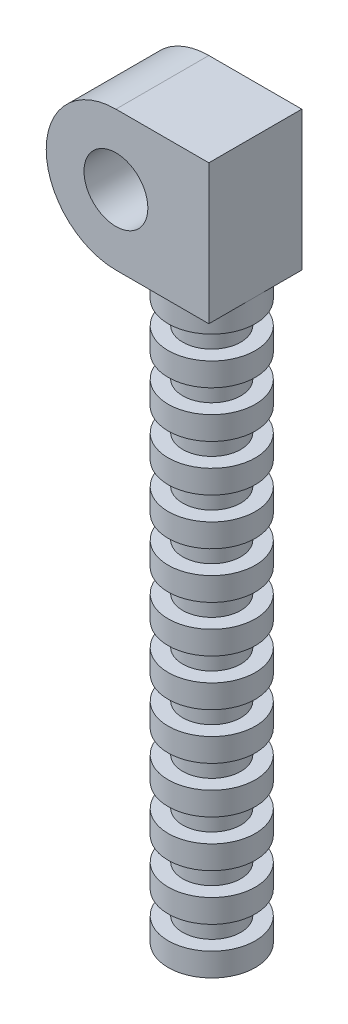
ISO-10303-21;
HEADER;
FILE_DESCRIPTION(('STEP AP214'),'2;1');
FILE_NAME('part.step','',(''),(''),'','','');
FILE_SCHEMA(('AUTOMOTIVE_DESIGN { 1 0 10303 214 1 1 1 1 }'));
ENDSEC;
DATA;
#1=APPLICATION_CONTEXT('core data for automotive mechanical design processes');
#2=APPLICATION_PROTOCOL_DEFINITION('international standard','automotive_design',2000,#1);
#3=PRODUCT_CONTEXT('',#1,'mechanical');
#4=PRODUCT('Part','Part','',(#3));
#5=PRODUCT_RELATED_PRODUCT_CATEGORY('part','',(#4));
#6=PRODUCT_DEFINITION_FORMATION('','',#4);
#7=PRODUCT_DEFINITION_CONTEXT('part definition',#1,'design');
#8=PRODUCT_DEFINITION('design','',#6,#7);
#9=PRODUCT_DEFINITION_SHAPE('','',#8);
#10=(LENGTH_UNIT() NAMED_UNIT(*) SI_UNIT(.MILLI.,.METRE.));
#11=(NAMED_UNIT(*) PLANE_ANGLE_UNIT() SI_UNIT($,.RADIAN.));
#12=(NAMED_UNIT(*) SI_UNIT($,.STERADIAN.) SOLID_ANGLE_UNIT());
#13=UNCERTAINTY_MEASURE_WITH_UNIT(LENGTH_MEASURE(1.E-05),#10,'distance_accuracy_value','');
#14=(GEOMETRIC_REPRESENTATION_CONTEXT(3) GLOBAL_UNCERTAINTY_ASSIGNED_CONTEXT((#13)) GLOBAL_UNIT_ASSIGNED_CONTEXT((#10,
#11,#12)) REPRESENTATION_CONTEXT('',''));
#15=CARTESIAN_POINT('',(0.,0.,0.));
#16=DIRECTION('',(0.,0.,1.));
#17=DIRECTION('',(1.,0.,0.));
#18=AXIS2_PLACEMENT_3D('',#15,#16,#17);
#19=CARTESIAN_POINT('',(0.,5.,0.));
#20=DIRECTION('',(0.,-1.,0.));
#21=DIRECTION('',(0.,0.,-1.));
#22=AXIS2_PLACEMENT_3D('',#19,#20,#21);
#23=CYLINDRICAL_SURFACE('',#22,0.5);
#24=CARTESIAN_POINT('',(0.,4.2,0.));
#25=DIRECTION('',(0.,1.,0.));
#26=DIRECTION('',(0.,0.,1.));
#27=AXIS2_PLACEMENT_3D('',#24,#25,#26);
#28=CIRCLE('',#27,0.5);
#29=CARTESIAN_POINT('',(0.,4.2,0.5));
#30=VERTEX_POINT('',#29);
#31=EDGE_CURVE('E202',#30,#30,#28,.T.);
#32=ORIENTED_EDGE('',*,*,#31,.T.);
#33=EDGE_LOOP('',(#32));
#34=FACE_BOUND('',#33,.T.);
#35=CARTESIAN_POINT('',(0.,4.6,0.));
#36=DIRECTION('',(0.,1.,0.));
#37=DIRECTION('',(0.,0.,1.));
#38=AXIS2_PLACEMENT_3D('',#35,#36,#37);
#39=CIRCLE('',#38,0.5);
#40=CARTESIAN_POINT('',(0.,4.6,0.5));
#41=VERTEX_POINT('',#40);
#42=EDGE_CURVE('E209',#41,#41,#39,.T.);
#43=ORIENTED_EDGE('',*,*,#42,.F.);
#44=EDGE_LOOP('',(#43));
#45=FACE_BOUND('',#44,.T.);
#46=ADVANCED_FACE('F37',(#34,#45),#23,.T.);
#47=CARTESIAN_POINT('',(0.,4.6,0.));
#48=DIRECTION('',(0.,1.,0.));
#49=DIRECTION('',(0.,0.,1.));
#50=AXIS2_PLACEMENT_3D('',#47,#48,#49);
#51=CYLINDRICAL_SURFACE('',#50,0.75);
#52=CARTESIAN_POINT('',(0.,4.6,0.));
#53=DIRECTION('',(0.,1.,0.));
#54=DIRECTION('',(0.,0.,1.));
#55=AXIS2_PLACEMENT_3D('',#52,#53,#54);
#56=CIRCLE('',#55,0.75);
#57=CARTESIAN_POINT('',(0.,4.6,0.75));
#58=VERTEX_POINT('',#57);
#59=EDGE_CURVE('E206',#58,#58,#56,.T.);
#60=ORIENTED_EDGE('',*,*,#59,.T.);
#61=EDGE_LOOP('',(#60));
#62=FACE_BOUND('',#61,.T.);
#63=CARTESIAN_POINT('',(0.,5.,0.));
#64=DIRECTION('',(0.,1.,0.));
#65=DIRECTION('',(0.,0.,1.));
#66=AXIS2_PLACEMENT_3D('',#63,#64,#65);
#67=CIRCLE('',#66,0.75);
#68=CARTESIAN_POINT('',(0.75,5.,0.));
#69=VERTEX_POINT('',#68);
#70=EDGE_CURVE('E50',#69,#69,#67,.T.);
#71=ORIENTED_EDGE('',*,*,#70,.F.);
#72=EDGE_LOOP('',(#71));
#73=FACE_BOUND('',#72,.T.);
#74=ADVANCED_FACE('F290',(#62,#73),#51,.T.);
#75=CARTESIAN_POINT('',(0.,4.6,0.));
#76=DIRECTION('',(0.,1.,0.));
#77=DIRECTION('',(0.,0.,1.));
#78=AXIS2_PLACEMENT_3D('',#75,#76,#77);
#79=PLANE('',#78);
#80=ORIENTED_EDGE('',*,*,#42,.T.);
#81=EDGE_LOOP('',(#80));
#82=FACE_BOUND('',#81,.T.);
#83=ORIENTED_EDGE('',*,*,#59,.F.);
#84=EDGE_LOOP('',(#83));
#85=FACE_BOUND('',#84,.T.);
#86=ADVANCED_FACE('F297',(#82,#85),#79,.F.);
#87=CARTESIAN_POINT('',(0.,3.8,0.));
#88=DIRECTION('',(0.,1.,0.));
#89=DIRECTION('',(0.,0.,1.));
#90=AXIS2_PLACEMENT_3D('',#87,#88,#89);
#91=CYLINDRICAL_SURFACE('',#90,0.75);
#92=CARTESIAN_POINT('',(0.,3.8,0.));
#93=DIRECTION('',(0.,1.,0.));
#94=DIRECTION('',(0.,0.,1.));
#95=AXIS2_PLACEMENT_3D('',#92,#93,#94);
#96=CIRCLE('',#95,0.75);
#97=CARTESIAN_POINT('',(0.,3.8,0.75));
#98=VERTEX_POINT('',#97);
#99=EDGE_CURVE('E199',#98,#98,#96,.T.);
#100=ORIENTED_EDGE('',*,*,#99,.T.);
#101=EDGE_LOOP('',(#100));
#102=FACE_BOUND('',#101,.T.);
#103=CARTESIAN_POINT('',(0.,4.2,0.));
#104=DIRECTION('',(0.,1.,0.));
#105=DIRECTION('',(0.,0.,1.));
#106=AXIS2_PLACEMENT_3D('',#103,#104,#105);
#107=CIRCLE('',#106,0.75);
#108=CARTESIAN_POINT('',(0.,4.2,0.75));
#109=VERTEX_POINT('',#108);
#110=EDGE_CURVE('E203',#109,#109,#107,.T.);
#111=ORIENTED_EDGE('',*,*,#110,.F.);
#112=EDGE_LOOP('',(#111));
#113=FACE_BOUND('',#112,.T.);
#114=ADVANCED_FACE('F474',(#102,#113),#91,.T.);
#115=CARTESIAN_POINT('',(0.,3.8,0.));
#116=DIRECTION('',(0.,1.,0.));
#117=DIRECTION('',(0.,0.,1.));
#118=AXIS2_PLACEMENT_3D('',#115,#116,#117);
#119=PLANE('',#118);
#120=CARTESIAN_POINT('',(0.,3.8,0.));
#121=DIRECTION('',(0.,1.,0.));
#122=DIRECTION('',(0.,0.,1.));
#123=AXIS2_PLACEMENT_3D('',#120,#121,#122);
#124=CIRCLE('',#123,0.5);
#125=CARTESIAN_POINT('',(0.,3.8,0.5));
#126=VERTEX_POINT('',#125);
#127=EDGE_CURVE('E213',#126,#126,#124,.T.);
#128=ORIENTED_EDGE('',*,*,#127,.T.);
#129=EDGE_LOOP('',(#128));
#130=FACE_BOUND('',#129,.T.);
#131=ORIENTED_EDGE('',*,*,#99,.F.);
#132=EDGE_LOOP('',(#131));
#133=FACE_BOUND('',#132,.T.);
#134=ADVANCED_FACE('F316',(#130,#133),#119,.F.);
#135=CARTESIAN_POINT('',(0.,4.2,0.));
#136=DIRECTION('',(0.,1.,0.));
#137=DIRECTION('',(0.,0.,1.));
#138=AXIS2_PLACEMENT_3D('',#135,#136,#137);
#139=PLANE('',#138);
#140=ORIENTED_EDGE('',*,*,#31,.F.);
#141=EDGE_LOOP('',(#140));
#142=FACE_BOUND('',#141,.T.);
#143=ORIENTED_EDGE('',*,*,#110,.T.);
#144=EDGE_LOOP('',(#143));
#145=FACE_BOUND('',#144,.T.);
#146=ADVANCED_FACE('F306',(#142,#145),#139,.T.);
#147=CARTESIAN_POINT('',(0.,3.4,0.));
#148=DIRECTION('',(0.,1.,0.));
#149=DIRECTION('',(0.,0.,1.));
#150=AXIS2_PLACEMENT_3D('',#147,#148,#149);
#151=CIRCLE('',#150,0.5);
#152=CARTESIAN_POINT('',(0.,3.4,0.5));
#153=VERTEX_POINT('',#152);
#154=EDGE_CURVE('E195',#153,#153,#151,.T.);
#155=ORIENTED_EDGE('',*,*,#154,.T.);
#156=EDGE_LOOP('',(#155));
#157=FACE_BOUND('',#156,.T.);
#158=ORIENTED_EDGE('',*,*,#127,.F.);
#159=EDGE_LOOP('',(#158));
#160=FACE_BOUND('',#159,.T.);
#161=ADVANCED_FACE('F292',(#157,#160),#23,.T.);
#162=CARTESIAN_POINT('',(0.,3.,0.));
#163=DIRECTION('',(0.,1.,0.));
#164=DIRECTION('',(0.,0.,1.));
#165=AXIS2_PLACEMENT_3D('',#162,#163,#164);
#166=CYLINDRICAL_SURFACE('',#165,0.75);
#167=CARTESIAN_POINT('',(0.,3.,0.));
#168=DIRECTION('',(0.,1.,0.));
#169=DIRECTION('',(0.,0.,1.));
#170=AXIS2_PLACEMENT_3D('',#167,#168,#169);
#171=CIRCLE('',#170,0.75);
#172=CARTESIAN_POINT('',(0.,3.,0.75));
#173=VERTEX_POINT('',#172);
#174=EDGE_CURVE('E192',#173,#173,#171,.T.);
#175=ORIENTED_EDGE('',*,*,#174,.T.);
#176=EDGE_LOOP('',(#175));
#177=FACE_BOUND('',#176,.T.);
#178=CARTESIAN_POINT('',(0.,3.4,0.));
#179=DIRECTION('',(0.,1.,0.));
#180=DIRECTION('',(0.,0.,1.));
#181=AXIS2_PLACEMENT_3D('',#178,#179,#180);
#182=CIRCLE('',#181,0.75);
#183=CARTESIAN_POINT('',(0.,3.4,0.75));
#184=VERTEX_POINT('',#183);
#185=EDGE_CURVE('E196',#184,#184,#182,.T.);
#186=ORIENTED_EDGE('',*,*,#185,.F.);
#187=EDGE_LOOP('',(#186));
#188=FACE_BOUND('',#187,.T.);
#189=ADVANCED_FACE('F305',(#177,#188),#166,.T.);
#190=CARTESIAN_POINT('',(0.,3.,0.));
#191=DIRECTION('',(0.,1.,0.));
#192=DIRECTION('',(0.,0.,1.));
#193=AXIS2_PLACEMENT_3D('',#190,#191,#192);
#194=PLANE('',#193);
#195=CARTESIAN_POINT('',(0.,3.,0.));
#196=DIRECTION('',(0.,1.,0.));
#197=DIRECTION('',(0.,0.,1.));
#198=AXIS2_PLACEMENT_3D('',#195,#196,#197);
#199=CIRCLE('',#198,0.5);
#200=CARTESIAN_POINT('',(0.,3.,0.5));
#201=VERTEX_POINT('',#200);
#202=EDGE_CURVE('E218',#201,#201,#199,.T.);
#203=ORIENTED_EDGE('',*,*,#202,.T.);
#204=EDGE_LOOP('',(#203));
#205=FACE_BOUND('',#204,.T.);
#206=ORIENTED_EDGE('',*,*,#174,.F.);
#207=EDGE_LOOP('',(#206));
#208=FACE_BOUND('',#207,.T.);
#209=ADVANCED_FACE('F313',(#205,#208),#194,.F.);
#210=CARTESIAN_POINT('',(0.,3.4,0.));
#211=DIRECTION('',(0.,1.,0.));
#212=DIRECTION('',(0.,0.,1.));
#213=AXIS2_PLACEMENT_3D('',#210,#211,#212);
#214=PLANE('',#213);
#215=ORIENTED_EDGE('',*,*,#154,.F.);
#216=EDGE_LOOP('',(#215));
#217=FACE_BOUND('',#216,.T.);
#218=ORIENTED_EDGE('',*,*,#185,.T.);
#219=EDGE_LOOP('',(#218));
#220=FACE_BOUND('',#219,.T.);
#221=ADVANCED_FACE('F322',(#217,#220),#214,.T.);
#222=CARTESIAN_POINT('',(0.,2.6,0.));
#223=DIRECTION('',(0.,1.,0.));
#224=DIRECTION('',(0.,0.,1.));
#225=AXIS2_PLACEMENT_3D('',#222,#223,#224);
#226=CIRCLE('',#225,0.5);
#227=CARTESIAN_POINT('',(0.,2.6,0.5));
#228=VERTEX_POINT('',#227);
#229=EDGE_CURVE('E188',#228,#228,#226,.T.);
#230=ORIENTED_EDGE('',*,*,#229,.T.);
#231=EDGE_LOOP('',(#230));
#232=FACE_BOUND('',#231,.T.);
#233=ORIENTED_EDGE('',*,*,#202,.F.);
#234=EDGE_LOOP('',(#233));
#235=FACE_BOUND('',#234,.T.);
#236=ADVANCED_FACE('F308',(#232,#235),#23,.T.);
#237=CARTESIAN_POINT('',(0.,2.2,0.));
#238=DIRECTION('',(0.,1.,0.));
#239=DIRECTION('',(0.,0.,1.));
#240=AXIS2_PLACEMENT_3D('',#237,#238,#239);
#241=CYLINDRICAL_SURFACE('',#240,0.75);
#242=CARTESIAN_POINT('',(0.,2.2,0.));
#243=DIRECTION('',(0.,1.,0.));
#244=DIRECTION('',(0.,0.,1.));
#245=AXIS2_PLACEMENT_3D('',#242,#243,#244);
#246=CIRCLE('',#245,0.75);
#247=CARTESIAN_POINT('',(0.,2.2,0.75));
#248=VERTEX_POINT('',#247);
#249=EDGE_CURVE('E185',#248,#248,#246,.T.);
#250=ORIENTED_EDGE('',*,*,#249,.T.);
#251=EDGE_LOOP('',(#250));
#252=FACE_BOUND('',#251,.T.);
#253=CARTESIAN_POINT('',(0.,2.6,0.));
#254=DIRECTION('',(0.,1.,0.));
#255=DIRECTION('',(0.,0.,1.));
#256=AXIS2_PLACEMENT_3D('',#253,#254,#255);
#257=CIRCLE('',#256,0.75);
#258=CARTESIAN_POINT('',(0.,2.6,0.75));
#259=VERTEX_POINT('',#258);
#260=EDGE_CURVE('E189',#259,#259,#257,.T.);
#261=ORIENTED_EDGE('',*,*,#260,.F.);
#262=EDGE_LOOP('',(#261));
#263=FACE_BOUND('',#262,.T.);
#264=ADVANCED_FACE('F321',(#252,#263),#241,.T.);
#265=CARTESIAN_POINT('',(0.,2.2,0.));
#266=DIRECTION('',(0.,1.,0.));
#267=DIRECTION('',(0.,0.,1.));
#268=AXIS2_PLACEMENT_3D('',#265,#266,#267);
#269=PLANE('',#268);
#270=CARTESIAN_POINT('',(0.,2.2,0.));
#271=DIRECTION('',(0.,1.,0.));
#272=DIRECTION('',(0.,0.,1.));
#273=AXIS2_PLACEMENT_3D('',#270,#271,#272);
#274=CIRCLE('',#273,0.5);
#275=CARTESIAN_POINT('',(0.,2.2,0.5));
#276=VERTEX_POINT('',#275);
#277=EDGE_CURVE('E223',#276,#276,#274,.T.);
#278=ORIENTED_EDGE('',*,*,#277,.T.);
#279=EDGE_LOOP('',(#278));
#280=FACE_BOUND('',#279,.T.);
#281=ORIENTED_EDGE('',*,*,#249,.F.);
#282=EDGE_LOOP('',(#281));
#283=FACE_BOUND('',#282,.T.);
#284=ADVANCED_FACE('F329',(#280,#283),#269,.F.);
#285=CARTESIAN_POINT('',(0.,2.6,0.));
#286=DIRECTION('',(0.,1.,0.));
#287=DIRECTION('',(0.,0.,1.));
#288=AXIS2_PLACEMENT_3D('',#285,#286,#287);
#289=PLANE('',#288);
#290=ORIENTED_EDGE('',*,*,#229,.F.);
#291=EDGE_LOOP('',(#290));
#292=FACE_BOUND('',#291,.T.);
#293=ORIENTED_EDGE('',*,*,#260,.T.);
#294=EDGE_LOOP('',(#293));
#295=FACE_BOUND('',#294,.T.);
#296=ADVANCED_FACE('F337',(#292,#295),#289,.T.);
#297=CARTESIAN_POINT('',(0.,1.8,0.));
#298=DIRECTION('',(0.,1.,0.));
#299=DIRECTION('',(0.,0.,1.));
#300=AXIS2_PLACEMENT_3D('',#297,#298,#299);
#301=CIRCLE('',#300,0.5);
#302=CARTESIAN_POINT('',(0.,1.8,0.5));
#303=VERTEX_POINT('',#302);
#304=EDGE_CURVE('E181',#303,#303,#301,.T.);
#305=ORIENTED_EDGE('',*,*,#304,.T.);
#306=EDGE_LOOP('',(#305));
#307=FACE_BOUND('',#306,.T.);
#308=ORIENTED_EDGE('',*,*,#277,.F.);
#309=EDGE_LOOP('',(#308));
#310=FACE_BOUND('',#309,.T.);
#311=ADVANCED_FACE('F324',(#307,#310),#23,.T.);
#312=CARTESIAN_POINT('',(0.,1.4,0.));
#313=DIRECTION('',(0.,1.,0.));
#314=DIRECTION('',(0.,0.,1.));
#315=AXIS2_PLACEMENT_3D('',#312,#313,#314);
#316=CYLINDRICAL_SURFACE('',#315,0.75);
#317=CARTESIAN_POINT('',(0.,1.4,0.));
#318=DIRECTION('',(0.,1.,0.));
#319=DIRECTION('',(0.,0.,1.));
#320=AXIS2_PLACEMENT_3D('',#317,#318,#319);
#321=CIRCLE('',#320,0.75);
#322=CARTESIAN_POINT('',(0.,1.4,0.75));
#323=VERTEX_POINT('',#322);
#324=EDGE_CURVE('E178',#323,#323,#321,.T.);
#325=ORIENTED_EDGE('',*,*,#324,.T.);
#326=EDGE_LOOP('',(#325));
#327=FACE_BOUND('',#326,.T.);
#328=CARTESIAN_POINT('',(0.,1.8,0.));
#329=DIRECTION('',(0.,1.,0.));
#330=DIRECTION('',(0.,0.,1.));
#331=AXIS2_PLACEMENT_3D('',#328,#329,#330);
#332=CIRCLE('',#331,0.75);
#333=CARTESIAN_POINT('',(0.,1.8,0.75));
#334=VERTEX_POINT('',#333);
#335=EDGE_CURVE('E182',#334,#334,#332,.T.);
#336=ORIENTED_EDGE('',*,*,#335,.F.);
#337=EDGE_LOOP('',(#336));
#338=FACE_BOUND('',#337,.T.);
#339=ADVANCED_FACE('F336',(#327,#338),#316,.T.);
#340=CARTESIAN_POINT('',(0.,1.4,0.));
#341=DIRECTION('',(0.,1.,0.));
#342=DIRECTION('',(0.,0.,1.));
#343=AXIS2_PLACEMENT_3D('',#340,#341,#342);
#344=PLANE('',#343);
#345=CARTESIAN_POINT('',(0.,1.4,0.));
#346=DIRECTION('',(0.,1.,0.));
#347=DIRECTION('',(0.,0.,1.));
#348=AXIS2_PLACEMENT_3D('',#345,#346,#347);
#349=CIRCLE('',#348,0.5);
#350=CARTESIAN_POINT('',(0.,1.4,0.5));
#351=VERTEX_POINT('',#350);
#352=EDGE_CURVE('E228',#351,#351,#349,.T.);
#353=ORIENTED_EDGE('',*,*,#352,.T.);
#354=EDGE_LOOP('',(#353));
#355=FACE_BOUND('',#354,.T.);
#356=ORIENTED_EDGE('',*,*,#324,.F.);
#357=EDGE_LOOP('',(#356));
#358=FACE_BOUND('',#357,.T.);
#359=ADVANCED_FACE('F344',(#355,#358),#344,.F.);
#360=CARTESIAN_POINT('',(0.,1.8,0.));
#361=DIRECTION('',(0.,1.,0.));
#362=DIRECTION('',(0.,0.,1.));
#363=AXIS2_PLACEMENT_3D('',#360,#361,#362);
#364=PLANE('',#363);
#365=ORIENTED_EDGE('',*,*,#304,.F.);
#366=EDGE_LOOP('',(#365));
#367=FACE_BOUND('',#366,.T.);
#368=ORIENTED_EDGE('',*,*,#335,.T.);
#369=EDGE_LOOP('',(#368));
#370=FACE_BOUND('',#369,.T.);
#371=ADVANCED_FACE('F352',(#367,#370),#364,.T.);
#372=CARTESIAN_POINT('',(0.,1.,0.));
#373=DIRECTION('',(0.,1.,0.));
#374=DIRECTION('',(0.,0.,1.));
#375=AXIS2_PLACEMENT_3D('',#372,#373,#374);
#376=CIRCLE('',#375,0.5);
#377=CARTESIAN_POINT('',(0.,1.,0.5));
#378=VERTEX_POINT('',#377);
#379=EDGE_CURVE('E174',#378,#378,#376,.T.);
#380=ORIENTED_EDGE('',*,*,#379,.T.);
#381=EDGE_LOOP('',(#380));
#382=FACE_BOUND('',#381,.T.);
#383=ORIENTED_EDGE('',*,*,#352,.F.);
#384=EDGE_LOOP('',(#383));
#385=FACE_BOUND('',#384,.T.);
#386=ADVANCED_FACE('F339',(#382,#385),#23,.T.);
#387=CARTESIAN_POINT('',(0.,0.6,0.));
#388=DIRECTION('',(0.,1.,0.));
#389=DIRECTION('',(0.,0.,1.));
#390=AXIS2_PLACEMENT_3D('',#387,#388,#389);
#391=CYLINDRICAL_SURFACE('',#390,0.75);
#392=CARTESIAN_POINT('',(0.,0.6,0.));
#393=DIRECTION('',(0.,1.,0.));
#394=DIRECTION('',(0.,0.,1.));
#395=AXIS2_PLACEMENT_3D('',#392,#393,#394);
#396=CIRCLE('',#395,0.75);
#397=CARTESIAN_POINT('',(0.,0.6,0.75));
#398=VERTEX_POINT('',#397);
#399=EDGE_CURVE('E171',#398,#398,#396,.T.);
#400=ORIENTED_EDGE('',*,*,#399,.T.);
#401=EDGE_LOOP('',(#400));
#402=FACE_BOUND('',#401,.T.);
#403=CARTESIAN_POINT('',(0.,1.,0.));
#404=DIRECTION('',(0.,1.,0.));
#405=DIRECTION('',(0.,0.,1.));
#406=AXIS2_PLACEMENT_3D('',#403,#404,#405);
#407=CIRCLE('',#406,0.75);
#408=CARTESIAN_POINT('',(0.,1.,0.75));
#409=VERTEX_POINT('',#408);
#410=EDGE_CURVE('E175',#409,#409,#407,.T.);
#411=ORIENTED_EDGE('',*,*,#410,.F.);
#412=EDGE_LOOP('',(#411));
#413=FACE_BOUND('',#412,.T.);
#414=ADVANCED_FACE('F351',(#402,#413),#391,.T.);
#415=CARTESIAN_POINT('',(0.,0.6,0.));
#416=DIRECTION('',(0.,1.,0.));
#417=DIRECTION('',(0.,0.,1.));
#418=AXIS2_PLACEMENT_3D('',#415,#416,#417);
#419=PLANE('',#418);
#420=CARTESIAN_POINT('',(0.,0.6,0.));
#421=DIRECTION('',(0.,1.,0.));
#422=DIRECTION('',(0.,0.,1.));
#423=AXIS2_PLACEMENT_3D('',#420,#421,#422);
#424=CIRCLE('',#423,0.5);
#425=CARTESIAN_POINT('',(0.,0.6,0.5));
#426=VERTEX_POINT('',#425);
#427=EDGE_CURVE('E233',#426,#426,#424,.T.);
#428=ORIENTED_EDGE('',*,*,#427,.T.);
#429=EDGE_LOOP('',(#428));
#430=FACE_BOUND('',#429,.T.);
#431=ORIENTED_EDGE('',*,*,#399,.F.);
#432=EDGE_LOOP('',(#431));
#433=FACE_BOUND('',#432,.T.);
#434=ADVANCED_FACE('F359',(#430,#433),#419,.F.);
#435=CARTESIAN_POINT('',(0.,1.,0.));
#436=DIRECTION('',(0.,1.,0.));
#437=DIRECTION('',(0.,0.,1.));
#438=AXIS2_PLACEMENT_3D('',#435,#436,#437);
#439=PLANE('',#438);
#440=ORIENTED_EDGE('',*,*,#379,.F.);
#441=EDGE_LOOP('',(#440));
#442=FACE_BOUND('',#441,.T.);
#443=ORIENTED_EDGE('',*,*,#410,.T.);
#444=EDGE_LOOP('',(#443));
#445=FACE_BOUND('',#444,.T.);
#446=ADVANCED_FACE('F367',(#442,#445),#439,.T.);
#447=CARTESIAN_POINT('',(0.,0.2,0.));
#448=DIRECTION('',(0.,1.,0.));
#449=DIRECTION('',(0.,0.,1.));
#450=AXIS2_PLACEMENT_3D('',#447,#448,#449);
#451=CIRCLE('',#450,0.5);
#452=CARTESIAN_POINT('',(0.,0.2,0.5));
#453=VERTEX_POINT('',#452);
#454=EDGE_CURVE('E167',#453,#453,#451,.T.);
#455=ORIENTED_EDGE('',*,*,#454,.T.);
#456=EDGE_LOOP('',(#455));
#457=FACE_BOUND('',#456,.T.);
#458=ORIENTED_EDGE('',*,*,#427,.F.);
#459=EDGE_LOOP('',(#458));
#460=FACE_BOUND('',#459,.T.);
#461=ADVANCED_FACE('F354',(#457,#460),#23,.T.);
#462=CARTESIAN_POINT('',(0.,-0.2,0.));
#463=DIRECTION('',(0.,1.,0.));
#464=DIRECTION('',(0.,0.,1.));
#465=AXIS2_PLACEMENT_3D('',#462,#463,#464);
#466=CYLINDRICAL_SURFACE('',#465,0.75);
#467=CARTESIAN_POINT('',(0.,-0.2,0.));
#468=DIRECTION('',(0.,1.,0.));
#469=DIRECTION('',(0.,0.,1.));
#470=AXIS2_PLACEMENT_3D('',#467,#468,#469);
#471=CIRCLE('',#470,0.75);
#472=CARTESIAN_POINT('',(0.,-0.2,0.75));
#473=VERTEX_POINT('',#472);
#474=EDGE_CURVE('E164',#473,#473,#471,.T.);
#475=ORIENTED_EDGE('',*,*,#474,.T.);
#476=EDGE_LOOP('',(#475));
#477=FACE_BOUND('',#476,.T.);
#478=CARTESIAN_POINT('',(0.,0.2,0.));
#479=DIRECTION('',(0.,1.,0.));
#480=DIRECTION('',(0.,0.,1.));
#481=AXIS2_PLACEMENT_3D('',#478,#479,#480);
#482=CIRCLE('',#481,0.75);
#483=CARTESIAN_POINT('',(0.,0.2,0.75));
#484=VERTEX_POINT('',#483);
#485=EDGE_CURVE('E168',#484,#484,#482,.T.);
#486=ORIENTED_EDGE('',*,*,#485,.F.);
#487=EDGE_LOOP('',(#486));
#488=FACE_BOUND('',#487,.T.);
#489=ADVANCED_FACE('F366',(#477,#488),#466,.T.);
#490=CARTESIAN_POINT('',(0.,-0.2,0.));
#491=DIRECTION('',(0.,1.,0.));
#492=DIRECTION('',(0.,0.,1.));
#493=AXIS2_PLACEMENT_3D('',#490,#491,#492);
#494=PLANE('',#493);
#495=CARTESIAN_POINT('',(0.,-0.200000000000001,0.));
#496=DIRECTION('',(0.,1.,0.));
#497=DIRECTION('',(0.,0.,1.));
#498=AXIS2_PLACEMENT_3D('',#495,#496,#497);
#499=CIRCLE('',#498,0.5);
#500=CARTESIAN_POINT('',(0.,-0.200000000000001,0.5));
#501=VERTEX_POINT('',#500);
#502=EDGE_CURVE('E238',#501,#501,#499,.T.);
#503=ORIENTED_EDGE('',*,*,#502,.T.);
#504=EDGE_LOOP('',(#503));
#505=FACE_BOUND('',#504,.T.);
#506=ORIENTED_EDGE('',*,*,#474,.F.);
#507=EDGE_LOOP('',(#506));
#508=FACE_BOUND('',#507,.T.);
#509=ADVANCED_FACE('F374',(#505,#508),#494,.F.);
#510=CARTESIAN_POINT('',(0.,0.2,0.));
#511=DIRECTION('',(0.,1.,0.));
#512=DIRECTION('',(0.,0.,1.));
#513=AXIS2_PLACEMENT_3D('',#510,#511,#512);
#514=PLANE('',#513);
#515=ORIENTED_EDGE('',*,*,#454,.F.);
#516=EDGE_LOOP('',(#515));
#517=FACE_BOUND('',#516,.T.);
#518=ORIENTED_EDGE('',*,*,#485,.T.);
#519=EDGE_LOOP('',(#518));
#520=FACE_BOUND('',#519,.T.);
#521=ADVANCED_FACE('F382',(#517,#520),#514,.T.);
#522=CARTESIAN_POINT('',(0.,-0.6,0.));
#523=DIRECTION('',(0.,1.,0.));
#524=DIRECTION('',(0.,0.,1.));
#525=AXIS2_PLACEMENT_3D('',#522,#523,#524);
#526=CIRCLE('',#525,0.5);
#527=CARTESIAN_POINT('',(0.,-0.6,0.5));
#528=VERTEX_POINT('',#527);
#529=EDGE_CURVE('E160',#528,#528,#526,.T.);
#530=ORIENTED_EDGE('',*,*,#529,.T.);
#531=EDGE_LOOP('',(#530));
#532=FACE_BOUND('',#531,.T.);
#533=ORIENTED_EDGE('',*,*,#502,.F.);
#534=EDGE_LOOP('',(#533));
#535=FACE_BOUND('',#534,.T.);
#536=ADVANCED_FACE('F369',(#532,#535),#23,.T.);
#537=CARTESIAN_POINT('',(0.,-1.,0.));
#538=DIRECTION('',(0.,1.,0.));
#539=DIRECTION('',(0.,0.,1.));
#540=AXIS2_PLACEMENT_3D('',#537,#538,#539);
#541=CYLINDRICAL_SURFACE('',#540,0.75);
#542=CARTESIAN_POINT('',(0.,-1.,0.));
#543=DIRECTION('',(0.,1.,0.));
#544=DIRECTION('',(0.,0.,1.));
#545=AXIS2_PLACEMENT_3D('',#542,#543,#544);
#546=CIRCLE('',#545,0.75);
#547=CARTESIAN_POINT('',(0.,-1.,0.75));
#548=VERTEX_POINT('',#547);
#549=EDGE_CURVE('E157',#548,#548,#546,.T.);
#550=ORIENTED_EDGE('',*,*,#549,.T.);
#551=EDGE_LOOP('',(#550));
#552=FACE_BOUND('',#551,.T.);
#553=CARTESIAN_POINT('',(0.,-0.6,0.));
#554=DIRECTION('',(0.,1.,0.));
#555=DIRECTION('',(0.,0.,1.));
#556=AXIS2_PLACEMENT_3D('',#553,#554,#555);
#557=CIRCLE('',#556,0.75);
#558=CARTESIAN_POINT('',(0.,-0.6,0.75));
#559=VERTEX_POINT('',#558);
#560=EDGE_CURVE('E161',#559,#559,#557,.T.);
#561=ORIENTED_EDGE('',*,*,#560,.F.);
#562=EDGE_LOOP('',(#561));
#563=FACE_BOUND('',#562,.T.);
#564=ADVANCED_FACE('F381',(#552,#563),#541,.T.);
#565=CARTESIAN_POINT('',(0.,-1.,0.));
#566=DIRECTION('',(0.,1.,0.));
#567=DIRECTION('',(0.,0.,1.));
#568=AXIS2_PLACEMENT_3D('',#565,#566,#567);
#569=PLANE('',#568);
#570=CARTESIAN_POINT('',(0.,-1.,0.));
#571=DIRECTION('',(0.,1.,0.));
#572=DIRECTION('',(0.,0.,1.));
#573=AXIS2_PLACEMENT_3D('',#570,#571,#572);
#574=CIRCLE('',#573,0.5);
#575=CARTESIAN_POINT('',(0.,-1.,0.5));
#576=VERTEX_POINT('',#575);
#577=EDGE_CURVE('E243',#576,#576,#574,.T.);
#578=ORIENTED_EDGE('',*,*,#577,.T.);
#579=EDGE_LOOP('',(#578));
#580=FACE_BOUND('',#579,.T.);
#581=ORIENTED_EDGE('',*,*,#549,.F.);
#582=EDGE_LOOP('',(#581));
#583=FACE_BOUND('',#582,.T.);
#584=ADVANCED_FACE('F389',(#580,#583),#569,.F.);
#585=CARTESIAN_POINT('',(0.,-0.6,0.));
#586=DIRECTION('',(0.,1.,0.));
#587=DIRECTION('',(0.,0.,1.));
#588=AXIS2_PLACEMENT_3D('',#585,#586,#587);
#589=PLANE('',#588);
#590=ORIENTED_EDGE('',*,*,#529,.F.);
#591=EDGE_LOOP('',(#590));
#592=FACE_BOUND('',#591,.T.);
#593=ORIENTED_EDGE('',*,*,#560,.T.);
#594=EDGE_LOOP('',(#593));
#595=FACE_BOUND('',#594,.T.);
#596=ADVANCED_FACE('F397',(#592,#595),#589,.T.);
#597=CARTESIAN_POINT('',(0.,-1.4,0.));
#598=DIRECTION('',(0.,1.,0.));
#599=DIRECTION('',(0.,0.,1.));
#600=AXIS2_PLACEMENT_3D('',#597,#598,#599);
#601=CIRCLE('',#600,0.5);
#602=CARTESIAN_POINT('',(0.,-1.4,0.5));
#603=VERTEX_POINT('',#602);
#604=EDGE_CURVE('E153',#603,#603,#601,.T.);
#605=ORIENTED_EDGE('',*,*,#604,.T.);
#606=EDGE_LOOP('',(#605));
#607=FACE_BOUND('',#606,.T.);
#608=ORIENTED_EDGE('',*,*,#577,.F.);
#609=EDGE_LOOP('',(#608));
#610=FACE_BOUND('',#609,.T.);
#611=ADVANCED_FACE('F384',(#607,#610),#23,.T.);
#612=CARTESIAN_POINT('',(0.,-1.8,0.));
#613=DIRECTION('',(0.,1.,0.));
#614=DIRECTION('',(0.,0.,1.));
#615=AXIS2_PLACEMENT_3D('',#612,#613,#614);
#616=CYLINDRICAL_SURFACE('',#615,0.75);
#617=CARTESIAN_POINT('',(0.,-1.8,0.));
#618=DIRECTION('',(0.,1.,0.));
#619=DIRECTION('',(0.,0.,1.));
#620=AXIS2_PLACEMENT_3D('',#617,#618,#619);
#621=CIRCLE('',#620,0.75);
#622=CARTESIAN_POINT('',(0.,-1.8,0.75));
#623=VERTEX_POINT('',#622);
#624=EDGE_CURVE('E150',#623,#623,#621,.T.);
#625=ORIENTED_EDGE('',*,*,#624,.T.);
#626=EDGE_LOOP('',(#625));
#627=FACE_BOUND('',#626,.T.);
#628=CARTESIAN_POINT('',(0.,-1.4,0.));
#629=DIRECTION('',(0.,1.,0.));
#630=DIRECTION('',(0.,0.,1.));
#631=AXIS2_PLACEMENT_3D('',#628,#629,#630);
#632=CIRCLE('',#631,0.75);
#633=CARTESIAN_POINT('',(0.,-1.4,0.75));
#634=VERTEX_POINT('',#633);
#635=EDGE_CURVE('E154',#634,#634,#632,.T.);
#636=ORIENTED_EDGE('',*,*,#635,.F.);
#637=EDGE_LOOP('',(#636));
#638=FACE_BOUND('',#637,.T.);
#639=ADVANCED_FACE('F396',(#627,#638),#616,.T.);
#640=CARTESIAN_POINT('',(0.,-1.8,0.));
#641=DIRECTION('',(0.,1.,0.));
#642=DIRECTION('',(0.,0.,1.));
#643=AXIS2_PLACEMENT_3D('',#640,#641,#642);
#644=PLANE('',#643);
#645=CARTESIAN_POINT('',(0.,-1.8,0.));
#646=DIRECTION('',(0.,1.,0.));
#647=DIRECTION('',(0.,0.,1.));
#648=AXIS2_PLACEMENT_3D('',#645,#646,#647);
#649=CIRCLE('',#648,0.5);
#650=CARTESIAN_POINT('',(0.,-1.8,0.5));
#651=VERTEX_POINT('',#650);
#652=EDGE_CURVE('E248',#651,#651,#649,.T.);
#653=ORIENTED_EDGE('',*,*,#652,.T.);
#654=EDGE_LOOP('',(#653));
#655=FACE_BOUND('',#654,.T.);
#656=ORIENTED_EDGE('',*,*,#624,.F.);
#657=EDGE_LOOP('',(#656));
#658=FACE_BOUND('',#657,.T.);
#659=ADVANCED_FACE('F404',(#655,#658),#644,.F.);
#660=CARTESIAN_POINT('',(0.,-1.4,0.));
#661=DIRECTION('',(0.,1.,0.));
#662=DIRECTION('',(0.,0.,1.));
#663=AXIS2_PLACEMENT_3D('',#660,#661,#662);
#664=PLANE('',#663);
#665=ORIENTED_EDGE('',*,*,#604,.F.);
#666=EDGE_LOOP('',(#665));
#667=FACE_BOUND('',#666,.T.);
#668=ORIENTED_EDGE('',*,*,#635,.T.);
#669=EDGE_LOOP('',(#668));
#670=FACE_BOUND('',#669,.T.);
#671=ADVANCED_FACE('F412',(#667,#670),#664,.T.);
#672=CARTESIAN_POINT('',(0.,-2.2,0.));
#673=DIRECTION('',(0.,1.,0.));
#674=DIRECTION('',(0.,0.,1.));
#675=AXIS2_PLACEMENT_3D('',#672,#673,#674);
#676=CIRCLE('',#675,0.5);
#677=CARTESIAN_POINT('',(0.,-2.2,0.5));
#678=VERTEX_POINT('',#677);
#679=EDGE_CURVE('E146',#678,#678,#676,.T.);
#680=ORIENTED_EDGE('',*,*,#679,.T.);
#681=EDGE_LOOP('',(#680));
#682=FACE_BOUND('',#681,.T.);
#683=ORIENTED_EDGE('',*,*,#652,.F.);
#684=EDGE_LOOP('',(#683));
#685=FACE_BOUND('',#684,.T.);
#686=ADVANCED_FACE('F399',(#682,#685),#23,.T.);
#687=CARTESIAN_POINT('',(0.,-2.6,0.));
#688=DIRECTION('',(0.,1.,0.));
#689=DIRECTION('',(0.,0.,1.));
#690=AXIS2_PLACEMENT_3D('',#687,#688,#689);
#691=CYLINDRICAL_SURFACE('',#690,0.75);
#692=CARTESIAN_POINT('',(0.,-2.6,0.));
#693=DIRECTION('',(0.,1.,0.));
#694=DIRECTION('',(0.,0.,1.));
#695=AXIS2_PLACEMENT_3D('',#692,#693,#694);
#696=CIRCLE('',#695,0.75);
#697=CARTESIAN_POINT('',(0.,-2.6,0.75));
#698=VERTEX_POINT('',#697);
#699=EDGE_CURVE('E143',#698,#698,#696,.T.);
#700=ORIENTED_EDGE('',*,*,#699,.T.);
#701=EDGE_LOOP('',(#700));
#702=FACE_BOUND('',#701,.T.);
#703=CARTESIAN_POINT('',(0.,-2.2,0.));
#704=DIRECTION('',(0.,1.,0.));
#705=DIRECTION('',(0.,0.,1.));
#706=AXIS2_PLACEMENT_3D('',#703,#704,#705);
#707=CIRCLE('',#706,0.75);
#708=CARTESIAN_POINT('',(0.,-2.2,0.75));
#709=VERTEX_POINT('',#708);
#710=EDGE_CURVE('E147',#709,#709,#707,.T.);
#711=ORIENTED_EDGE('',*,*,#710,.F.);
#712=EDGE_LOOP('',(#711));
#713=FACE_BOUND('',#712,.T.);
#714=ADVANCED_FACE('F411',(#702,#713),#691,.T.);
#715=CARTESIAN_POINT('',(0.,-2.6,0.));
#716=DIRECTION('',(0.,1.,0.));
#717=DIRECTION('',(0.,0.,1.));
#718=AXIS2_PLACEMENT_3D('',#715,#716,#717);
#719=PLANE('',#718);
#720=CARTESIAN_POINT('',(0.,-2.6,0.));
#721=DIRECTION('',(0.,1.,0.));
#722=DIRECTION('',(0.,0.,1.));
#723=AXIS2_PLACEMENT_3D('',#720,#721,#722);
#724=CIRCLE('',#723,0.5);
#725=CARTESIAN_POINT('',(0.,-2.6,0.5));
#726=VERTEX_POINT('',#725);
#727=EDGE_CURVE('E253',#726,#726,#724,.T.);
#728=ORIENTED_EDGE('',*,*,#727,.T.);
#729=EDGE_LOOP('',(#728));
#730=FACE_BOUND('',#729,.T.);
#731=ORIENTED_EDGE('',*,*,#699,.F.);
#732=EDGE_LOOP('',(#731));
#733=FACE_BOUND('',#732,.T.);
#734=ADVANCED_FACE('F418',(#730,#733),#719,.F.);
#735=CARTESIAN_POINT('',(0.,-2.2,0.));
#736=DIRECTION('',(0.,1.,0.));
#737=DIRECTION('',(0.,0.,1.));
#738=AXIS2_PLACEMENT_3D('',#735,#736,#737);
#739=PLANE('',#738);
#740=ORIENTED_EDGE('',*,*,#679,.F.);
#741=EDGE_LOOP('',(#740));
#742=FACE_BOUND('',#741,.T.);
#743=ORIENTED_EDGE('',*,*,#710,.T.);
#744=EDGE_LOOP('',(#743));
#745=FACE_BOUND('',#744,.T.);
#746=ADVANCED_FACE('F426',(#742,#745),#739,.T.);
#747=CARTESIAN_POINT('',(0.,-3.,0.));
#748=DIRECTION('',(0.,1.,0.));
#749=DIRECTION('',(0.,0.,1.));
#750=AXIS2_PLACEMENT_3D('',#747,#748,#749);
#751=CIRCLE('',#750,0.5);
#752=CARTESIAN_POINT('',(0.,-3.,0.5));
#753=VERTEX_POINT('',#752);
#754=EDGE_CURVE('E139',#753,#753,#751,.T.);
#755=ORIENTED_EDGE('',*,*,#754,.T.);
#756=EDGE_LOOP('',(#755));
#757=FACE_BOUND('',#756,.T.);
#758=ORIENTED_EDGE('',*,*,#727,.F.);
#759=EDGE_LOOP('',(#758));
#760=FACE_BOUND('',#759,.T.);
#761=ADVANCED_FACE('F287',(#757,#760),#23,.T.);
#762=CARTESIAN_POINT('',(0.,-3.4,0.));
#763=DIRECTION('',(0.,1.,0.));
#764=DIRECTION('',(0.,0.,1.));
#765=AXIS2_PLACEMENT_3D('',#762,#763,#764);
#766=CYLINDRICAL_SURFACE('',#765,0.75);
#767=CARTESIAN_POINT('',(0.,-3.4,0.));
#768=DIRECTION('',(0.,1.,0.));
#769=DIRECTION('',(0.,0.,1.));
#770=AXIS2_PLACEMENT_3D('',#767,#768,#769);
#771=CIRCLE('',#770,0.75);
#772=CARTESIAN_POINT('',(0.,-3.4,0.75));
#773=VERTEX_POINT('',#772);
#774=EDGE_CURVE('E136',#773,#773,#771,.T.);
#775=ORIENTED_EDGE('',*,*,#774,.T.);
#776=EDGE_LOOP('',(#775));
#777=FACE_BOUND('',#776,.T.);
#778=CARTESIAN_POINT('',(0.,-3.,0.));
#779=DIRECTION('',(0.,1.,0.));
#780=DIRECTION('',(0.,0.,1.));
#781=AXIS2_PLACEMENT_3D('',#778,#779,#780);
#782=CIRCLE('',#781,0.75);
#783=CARTESIAN_POINT('',(0.,-3.,0.75));
#784=VERTEX_POINT('',#783);
#785=EDGE_CURVE('E140',#784,#784,#782,.T.);
#786=ORIENTED_EDGE('',*,*,#785,.F.);
#787=EDGE_LOOP('',(#786));
#788=FACE_BOUND('',#787,.T.);
#789=ADVANCED_FACE('F425',(#777,#788),#766,.T.);
#790=CARTESIAN_POINT('',(0.,-3.4,0.));
#791=DIRECTION('',(0.,1.,0.));
#792=DIRECTION('',(0.,0.,1.));
#793=AXIS2_PLACEMENT_3D('',#790,#791,#792);
#794=PLANE('',#793);
#795=CARTESIAN_POINT('',(0.,-3.4,0.));
#796=DIRECTION('',(0.,1.,0.));
#797=DIRECTION('',(0.,0.,1.));
#798=AXIS2_PLACEMENT_3D('',#795,#796,#797);
#799=CIRCLE('',#798,0.5);
#800=CARTESIAN_POINT('',(0.,-3.4,0.5));
#801=VERTEX_POINT('',#800);
#802=EDGE_CURVE('E45',#801,#801,#799,.T.);
#803=ORIENTED_EDGE('',*,*,#802,.T.);
#804=EDGE_LOOP('',(#803));
#805=FACE_BOUND('',#804,.T.);
#806=ORIENTED_EDGE('',*,*,#774,.F.);
#807=EDGE_LOOP('',(#806));
#808=FACE_BOUND('',#807,.T.);
#809=ADVANCED_FACE('F432',(#805,#808),#794,.F.);
#810=CARTESIAN_POINT('',(0.,-3.,0.));
#811=DIRECTION('',(0.,1.,0.));
#812=DIRECTION('',(0.,0.,1.));
#813=AXIS2_PLACEMENT_3D('',#810,#811,#812);
#814=PLANE('',#813);
#815=ORIENTED_EDGE('',*,*,#754,.F.);
#816=EDGE_LOOP('',(#815));
#817=FACE_BOUND('',#816,.T.);
#818=ORIENTED_EDGE('',*,*,#785,.T.);
#819=EDGE_LOOP('',(#818));
#820=FACE_BOUND('',#819,.T.);
#821=ADVANCED_FACE('F286',(#817,#820),#814,.T.);
#822=CARTESIAN_POINT('',(0.,-3.8,0.));
#823=DIRECTION('',(0.,1.,0.));
#824=DIRECTION('',(0.,0.,1.));
#825=AXIS2_PLACEMENT_3D('',#822,#823,#824);
#826=CIRCLE('',#825,0.5);
#827=CARTESIAN_POINT('',(0.,-3.8,0.5));
#828=VERTEX_POINT('',#827);
#829=EDGE_CURVE('E132',#828,#828,#826,.T.);
#830=ORIENTED_EDGE('',*,*,#829,.T.);
#831=EDGE_LOOP('',(#830));
#832=FACE_BOUND('',#831,.T.);
#833=ORIENTED_EDGE('',*,*,#802,.F.);
#834=EDGE_LOOP('',(#833));
#835=FACE_BOUND('',#834,.T.);
#836=ADVANCED_FACE('F265',(#832,#835),#23,.T.);
#837=CARTESIAN_POINT('',(0.,-4.2,0.));
#838=DIRECTION('',(0.,1.,0.));
#839=DIRECTION('',(0.,0.,1.));
#840=AXIS2_PLACEMENT_3D('',#837,#838,#839);
#841=CYLINDRICAL_SURFACE('',#840,0.75);
#842=CARTESIAN_POINT('',(0.,-4.2,0.));
#843=DIRECTION('',(0.,1.,0.));
#844=DIRECTION('',(0.,0.,1.));
#845=AXIS2_PLACEMENT_3D('',#842,#843,#844);
#846=CIRCLE('',#845,0.75);
#847=CARTESIAN_POINT('',(0.,-4.2,0.75));
#848=VERTEX_POINT('',#847);
#849=EDGE_CURVE('E129',#848,#848,#846,.T.);
#850=ORIENTED_EDGE('',*,*,#849,.T.);
#851=EDGE_LOOP('',(#850));
#852=FACE_BOUND('',#851,.T.);
#853=CARTESIAN_POINT('',(0.,-3.8,0.));
#854=DIRECTION('',(0.,1.,0.));
#855=DIRECTION('',(0.,0.,1.));
#856=AXIS2_PLACEMENT_3D('',#853,#854,#855);
#857=CIRCLE('',#856,0.75);
#858=CARTESIAN_POINT('',(0.,-3.8,0.75));
#859=VERTEX_POINT('',#858);
#860=EDGE_CURVE('E133',#859,#859,#857,.T.);
#861=ORIENTED_EDGE('',*,*,#860,.F.);
#862=EDGE_LOOP('',(#861));
#863=FACE_BOUND('',#862,.T.);
#864=ADVANCED_FACE('F276',(#852,#863),#841,.T.);
#865=CARTESIAN_POINT('',(0.,-4.2,0.));
#866=DIRECTION('',(0.,1.,0.));
#867=DIRECTION('',(0.,0.,1.));
#868=AXIS2_PLACEMENT_3D('',#865,#866,#867);
#869=PLANE('',#868);
#870=CARTESIAN_POINT('',(0.,-4.2,0.));
#871=DIRECTION('',(0.,1.,0.));
#872=DIRECTION('',(0.,0.,1.));
#873=AXIS2_PLACEMENT_3D('',#870,#871,#872);
#874=CIRCLE('',#873,0.5);
#875=CARTESIAN_POINT('',(0.,-4.2,0.5));
#876=VERTEX_POINT('',#875);
#877=EDGE_CURVE('E11',#876,#876,#874,.T.);
#878=ORIENTED_EDGE('',*,*,#877,.T.);
#879=EDGE_LOOP('',(#878));
#880=FACE_BOUND('',#879,.T.);
#881=ORIENTED_EDGE('',*,*,#849,.F.);
#882=EDGE_LOOP('',(#881));
#883=FACE_BOUND('',#882,.T.);
#884=ADVANCED_FACE('F272',(#880,#883),#869,.F.);
#885=CARTESIAN_POINT('',(0.,-3.8,0.));
#886=DIRECTION('',(0.,1.,0.));
#887=DIRECTION('',(0.,0.,1.));
#888=AXIS2_PLACEMENT_3D('',#885,#886,#887);
#889=PLANE('',#888);
#890=ORIENTED_EDGE('',*,*,#829,.F.);
#891=EDGE_LOOP('',(#890));
#892=FACE_BOUND('',#891,.T.);
#893=ORIENTED_EDGE('',*,*,#860,.T.);
#894=EDGE_LOOP('',(#893));
#895=FACE_BOUND('',#894,.T.);
#896=ADVANCED_FACE('F268',(#892,#895),#889,.T.);
#897=CARTESIAN_POINT('',(0.,-4.6,0.));
#898=DIRECTION('',(0.,1.,0.));
#899=DIRECTION('',(0.,0.,1.));
#900=AXIS2_PLACEMENT_3D('',#897,#898,#899);
#901=CIRCLE('',#900,0.5);
#902=CARTESIAN_POINT('',(0.,-4.6,0.5));
#903=VERTEX_POINT('',#902);
#904=EDGE_CURVE('E40',#903,#903,#901,.T.);
#905=ORIENTED_EDGE('',*,*,#904,.T.);
#906=EDGE_LOOP('',(#905));
#907=FACE_BOUND('',#906,.T.);
#908=ORIENTED_EDGE('',*,*,#877,.F.);
#909=EDGE_LOOP('',(#908));
#910=FACE_BOUND('',#909,.T.);
#911=ADVANCED_FACE('F271',(#907,#910),#23,.T.);
#912=CARTESIAN_POINT('',(0.,-5.,0.));
#913=DIRECTION('',(0.,1.,0.));
#914=DIRECTION('',(0.,0.,1.));
#915=AXIS2_PLACEMENT_3D('',#912,#913,#914);
#916=CYLINDRICAL_SURFACE('',#915,0.75);
#917=CARTESIAN_POINT('',(0.,-5.,0.));
#918=DIRECTION('',(0.,1.,0.));
#919=DIRECTION('',(0.,0.,1.));
#920=AXIS2_PLACEMENT_3D('',#917,#918,#919);
#921=CIRCLE('',#920,0.75);
#922=CARTESIAN_POINT('',(0.,-5.,0.75));
#923=VERTEX_POINT('',#922);
#924=EDGE_CURVE('E124',#923,#923,#921,.T.);
#925=ORIENTED_EDGE('',*,*,#924,.T.);
#926=EDGE_LOOP('',(#925));
#927=FACE_BOUND('',#926,.T.);
#928=CARTESIAN_POINT('',(0.,-4.6,0.));
#929=DIRECTION('',(0.,1.,0.));
#930=DIRECTION('',(0.,0.,1.));
#931=AXIS2_PLACEMENT_3D('',#928,#929,#930);
#932=CIRCLE('',#931,0.75);
#933=CARTESIAN_POINT('',(0.,-4.6,0.75));
#934=VERTEX_POINT('',#933);
#935=EDGE_CURVE('E123',#934,#934,#932,.T.);
#936=ORIENTED_EDGE('',*,*,#935,.F.);
#937=EDGE_LOOP('',(#936));
#938=FACE_BOUND('',#937,.T.);
#939=ADVANCED_FACE('F302',(#927,#938),#916,.T.);
#940=CARTESIAN_POINT('',(0.,-4.6,0.));
#941=DIRECTION('',(0.,1.,0.));
#942=DIRECTION('',(0.,0.,1.));
#943=AXIS2_PLACEMENT_3D('',#940,#941,#942);
#944=PLANE('',#943);
#945=ORIENTED_EDGE('',*,*,#904,.F.);
#946=EDGE_LOOP('',(#945));
#947=FACE_BOUND('',#946,.T.);
#948=ORIENTED_EDGE('',*,*,#935,.T.);
#949=EDGE_LOOP('',(#948));
#950=FACE_BOUND('',#949,.T.);
#951=ADVANCED_FACE('F485',(#947,#950),#944,.T.);
#952=CARTESIAN_POINT('',(0.,-5.,0.));
#953=DIRECTION('',(0.,1.,0.));
#954=DIRECTION('',(0.,0.,1.));
#955=AXIS2_PLACEMENT_3D('',#952,#953,#954);
#956=PLANE('',#955);
#957=ORIENTED_EDGE('',*,*,#924,.F.);
#958=EDGE_LOOP('',(#957));
#959=FACE_BOUND('',#958,.T.);
#960=ADVANCED_FACE('F482',(#959),#956,.F.);
#961=CARTESIAN_POINT('',(0.75,5.,0.8));
#962=DIRECTION('',(-1.,0.,0.));
#963=DIRECTION('',(0.,-1.,0.));
#964=AXIS2_PLACEMENT_3D('',#961,#962,#963);
#965=PLANE('',#964);
#966=DIRECTION('',(0.,1.,0.));
#967=VECTOR('',#966,1.);
#968=CARTESIAN_POINT('',(0.75,5.,-0.8));
#969=LINE('',#968,#967);
#970=CARTESIAN_POINT('',(0.75,5.,-0.8));
#971=VERTEX_POINT('',#970);
#972=CARTESIAN_POINT('',(0.75,7.4,-0.8));
#973=VERTEX_POINT('',#972);
#974=EDGE_CURVE('E111',#971,#973,#969,.T.);
#975=ORIENTED_EDGE('',*,*,#974,.T.);
#976=DIRECTION('',(0.,0.,-1.));
#977=VECTOR('',#976,1.);
#978=CARTESIAN_POINT('',(0.75,7.4,0.8));
#979=LINE('',#978,#977);
#980=CARTESIAN_POINT('',(0.75,7.4,0.8));
#981=VERTEX_POINT('',#980);
#982=EDGE_CURVE('E102',#981,#973,#979,.T.);
#983=ORIENTED_EDGE('',*,*,#982,.F.);
#984=DIRECTION('',(0.,1.,0.));
#985=VECTOR('',#984,1.);
#986=CARTESIAN_POINT('',(0.75,5.,0.8));
#987=LINE('',#986,#985);
#988=CARTESIAN_POINT('',(0.75,5.,0.8));
#989=VERTEX_POINT('',#988);
#990=EDGE_CURVE('E93',#989,#981,#987,.T.);
#991=ORIENTED_EDGE('',*,*,#990,.F.);
#992=DIRECTION('',(0.,0.,-1.));
#993=VECTOR('',#992,1.);
#994=CARTESIAN_POINT('',(0.75,5.,0.8));
#995=LINE('',#994,#993);
#996=EDGE_CURVE('E119',#989,#69,#995,.T.);
#997=ORIENTED_EDGE('',*,*,#996,.T.);
#998=EDGE_CURVE('E79',#69,#971,#995,.T.);
#999=ORIENTED_EDGE('',*,*,#998,.T.);
#1000=EDGE_LOOP('',(#975,#983,#991,#997,#999));
#1001=FACE_BOUND('',#1000,.T.);
#1002=ADVANCED_FACE('F484',(#1001),#965,.F.);
#1003=CARTESIAN_POINT('',(0.75,7.4,0.8));
#1004=DIRECTION('',(0.,-1.,0.));
#1005=DIRECTION('',(0.,0.,-1.));
#1006=AXIS2_PLACEMENT_3D('',#1003,#1004,#1005);
#1007=PLANE('',#1006);
#1008=DIRECTION('',(-1.,0.,0.));
#1009=VECTOR('',#1008,1.);
#1010=CARTESIAN_POINT('',(0.75,7.4,-0.8));
#1011=LINE('',#1010,#1009);
#1012=CARTESIAN_POINT('',(-0.85,7.4,-0.8));
#1013=VERTEX_POINT('',#1012);
#1014=EDGE_CURVE('E99',#973,#1013,#1011,.T.);
#1015=ORIENTED_EDGE('',*,*,#1014,.T.);
#1016=DIRECTION('',(0.,0.,-1.));
#1017=VECTOR('',#1016,1.);
#1018=CARTESIAN_POINT('',(-0.85,7.4,0.8));
#1019=LINE('',#1018,#1017);
#1020=CARTESIAN_POINT('',(-0.85,7.4,0.8));
#1021=VERTEX_POINT('',#1020);
#1022=EDGE_CURVE('E97',#1021,#1013,#1019,.T.);
#1023=ORIENTED_EDGE('',*,*,#1022,.F.);
#1024=DIRECTION('',(-1.,0.,0.));
#1025=VECTOR('',#1024,1.);
#1026=CARTESIAN_POINT('',(0.75,7.4,0.8));
#1027=LINE('',#1026,#1025);
#1028=EDGE_CURVE('E87',#981,#1021,#1027,.T.);
#1029=ORIENTED_EDGE('',*,*,#1028,.F.);
#1030=ORIENTED_EDGE('',*,*,#982,.T.);
#1031=EDGE_LOOP('',(#1015,#1023,#1029,#1030));
#1032=FACE_BOUND('',#1031,.T.);
#1033=ADVANCED_FACE('F98',(#1032),#1007,.F.);
#1034=CARTESIAN_POINT('',(-0.85,6.2,0.8));
#1035=DIRECTION('',(0.,0.,-1.));
#1036=DIRECTION('',(-1.,0.,0.));
#1037=AXIS2_PLACEMENT_3D('',#1034,#1035,#1036);
#1038=CYLINDRICAL_SURFACE('',#1037,1.2);
#1039=CARTESIAN_POINT('',(-0.85,6.2,-0.8));
#1040=DIRECTION('',(0.,0.,1.));
#1041=DIRECTION('',(1.,0.,0.));
#1042=AXIS2_PLACEMENT_3D('',#1039,#1040,#1041);
#1043=CIRCLE('',#1042,1.2);
#1044=CARTESIAN_POINT('',(-0.85,5.,-0.8));
#1045=VERTEX_POINT('',#1044);
#1046=EDGE_CURVE('E115',#1013,#1045,#1043,.T.);
#1047=ORIENTED_EDGE('',*,*,#1046,.T.);
#1048=DIRECTION('',(0.,0.,-1.));
#1049=VECTOR('',#1048,1.);
#1050=CARTESIAN_POINT('',(-0.85,5.,0.8));
#1051=LINE('',#1050,#1049);
#1052=CARTESIAN_POINT('',(-0.85,5.,0.8));
#1053=VERTEX_POINT('',#1052);
#1054=EDGE_CURVE('E103',#1053,#1045,#1051,.T.);
#1055=ORIENTED_EDGE('',*,*,#1054,.F.);
#1056=CARTESIAN_POINT('',(-0.85,6.2,0.8));
#1057=DIRECTION('',(0.,0.,1.));
#1058=DIRECTION('',(1.,0.,0.));
#1059=AXIS2_PLACEMENT_3D('',#1056,#1057,#1058);
#1060=CIRCLE('',#1059,1.2);
#1061=EDGE_CURVE('E90',#1021,#1053,#1060,.T.);
#1062=ORIENTED_EDGE('',*,*,#1061,.F.);
#1063=ORIENTED_EDGE('',*,*,#1022,.T.);
#1064=EDGE_LOOP('',(#1047,#1055,#1062,#1063));
#1065=FACE_BOUND('',#1064,.T.);
#1066=ADVANCED_FACE('F105',(#1065),#1038,.T.);
#1067=CARTESIAN_POINT('',(0.75,5.,0.8));
#1068=DIRECTION('',(0.,1.,0.));
#1069=DIRECTION('',(0.,0.,1.));
#1070=AXIS2_PLACEMENT_3D('',#1067,#1068,#1069);
#1071=PLANE('',#1070);
#1072=ORIENTED_EDGE('',*,*,#998,.F.);
#1073=ORIENTED_EDGE('',*,*,#70,.T.);
#1074=ORIENTED_EDGE('',*,*,#996,.F.);
#1075=DIRECTION('',(1.,0.,0.));
#1076=VECTOR('',#1075,1.);
#1077=CARTESIAN_POINT('',(0.75,5.,0.8));
#1078=LINE('',#1077,#1076);
#1079=EDGE_CURVE('E58',#1053,#989,#1078,.T.);
#1080=ORIENTED_EDGE('',*,*,#1079,.F.);
#1081=ORIENTED_EDGE('',*,*,#1054,.T.);
#1082=DIRECTION('',(1.,0.,0.));
#1083=VECTOR('',#1082,1.);
#1084=CARTESIAN_POINT('',(0.75,5.,-0.8));
#1085=LINE('',#1084,#1083);
#1086=EDGE_CURVE('E117',#1045,#971,#1085,.T.);
#1087=ORIENTED_EDGE('',*,*,#1086,.T.);
#1088=EDGE_LOOP('',(#1072,#1073,#1074,#1080,#1081,#1087));
#1089=FACE_BOUND('',#1088,.T.);
#1090=ADVANCED_FACE('F508',(#1089),#1071,.F.);
#1091=CARTESIAN_POINT('',(-0.85,6.2,0.8));
#1092=DIRECTION('',(0.,0.,1.));
#1093=DIRECTION('',(1.,0.,0.));
#1094=AXIS2_PLACEMENT_3D('',#1091,#1092,#1093);
#1095=PLANE('',#1094);
#1096=CARTESIAN_POINT('',(-0.85,6.2,0.8));
#1097=DIRECTION('',(0.,0.,1.));
#1098=DIRECTION('',(1.,0.,0.));
#1099=AXIS2_PLACEMENT_3D('',#1096,#1097,#1098);
#1100=CIRCLE('',#1099,0.55);
#1101=CARTESIAN_POINT('',(-0.3,6.2,0.8));
#1102=VERTEX_POINT('',#1101);
#1103=EDGE_CURVE('E529',#1102,#1102,#1100,.T.);
#1104=ORIENTED_EDGE('',*,*,#1103,.F.);
#1105=EDGE_LOOP('',(#1104));
#1106=FACE_BOUND('',#1105,.T.);
#1107=ORIENTED_EDGE('',*,*,#990,.T.);
#1108=ORIENTED_EDGE('',*,*,#1028,.T.);
#1109=ORIENTED_EDGE('',*,*,#1061,.T.);
#1110=ORIENTED_EDGE('',*,*,#1079,.T.);
#1111=EDGE_LOOP('',(#1107,#1108,#1109,#1110));
#1112=FACE_BOUND('',#1111,.T.);
#1113=ADVANCED_FACE('F88',(#1106,#1112),#1095,.T.);
#1114=CARTESIAN_POINT('',(-0.85,6.2,-0.8));
#1115=DIRECTION('',(0.,0.,1.));
#1116=DIRECTION('',(1.,0.,0.));
#1117=AXIS2_PLACEMENT_3D('',#1114,#1115,#1116);
#1118=PLANE('',#1117);
#1119=CARTESIAN_POINT('',(-0.85,6.2,-0.8));
#1120=DIRECTION('',(0.,0.,1.));
#1121=DIRECTION('',(1.,0.,0.));
#1122=AXIS2_PLACEMENT_3D('',#1119,#1120,#1121);
#1123=CIRCLE('',#1122,0.55);
#1124=CARTESIAN_POINT('',(-0.3,6.2,-0.8));
#1125=VERTEX_POINT('',#1124);
#1126=EDGE_CURVE('E113',#1125,#1125,#1123,.T.);
#1127=ORIENTED_EDGE('',*,*,#1126,.T.);
#1128=EDGE_LOOP('',(#1127));
#1129=FACE_BOUND('',#1128,.T.);
#1130=ORIENTED_EDGE('',*,*,#974,.F.);
#1131=ORIENTED_EDGE('',*,*,#1086,.F.);
#1132=ORIENTED_EDGE('',*,*,#1046,.F.);
#1133=ORIENTED_EDGE('',*,*,#1014,.F.);
#1134=EDGE_LOOP('',(#1130,#1131,#1132,#1133));
#1135=FACE_BOUND('',#1134,.T.);
#1136=ADVANCED_FACE('F512',(#1129,#1135),#1118,.F.);
#1137=CARTESIAN_POINT('',(-0.85,6.2,-0.8));
#1138=DIRECTION('',(0.,0.,1.));
#1139=DIRECTION('',(1.,0.,0.));
#1140=AXIS2_PLACEMENT_3D('',#1137,#1138,#1139);
#1141=CYLINDRICAL_SURFACE('',#1140,0.55);
#1142=ORIENTED_EDGE('',*,*,#1126,.F.);
#1143=EDGE_LOOP('',(#1142));
#1144=FACE_BOUND('',#1143,.T.);
#1145=ORIENTED_EDGE('',*,*,#1103,.T.);
#1146=EDGE_LOOP('',(#1145));
#1147=FACE_BOUND('',#1146,.T.);
#1148=ADVANCED_FACE('F515',(#1144,#1147),#1141,.F.);
#1149=CLOSED_SHELL('',(#46,#74,#86,#114,#134,#146,#161,#189,#209,#221,#236,#264,#284,#296,#311,
#339,#359,#371,#386,#414,#434,#446,#461,#489,#509,#521,#536,#564,#584,#596,#611,#639,#659,#671,
#686,#714,#734,#746,#761,#789,#809,#821,#836,#864,#884,#896,#911,#939,#951,#960,#1002,#1033,
#1066,#1090,#1113,#1136,#1148));
#1150=MANIFOLD_SOLID_BREP('B2',#1149);
#1151=ADVANCED_BREP_SHAPE_REPRESENTATION('',(#18,#1150),#14);
#1152=SHAPE_DEFINITION_REPRESENTATION(#9,#1151);
ENDSEC;
END-ISO-10303-21;
